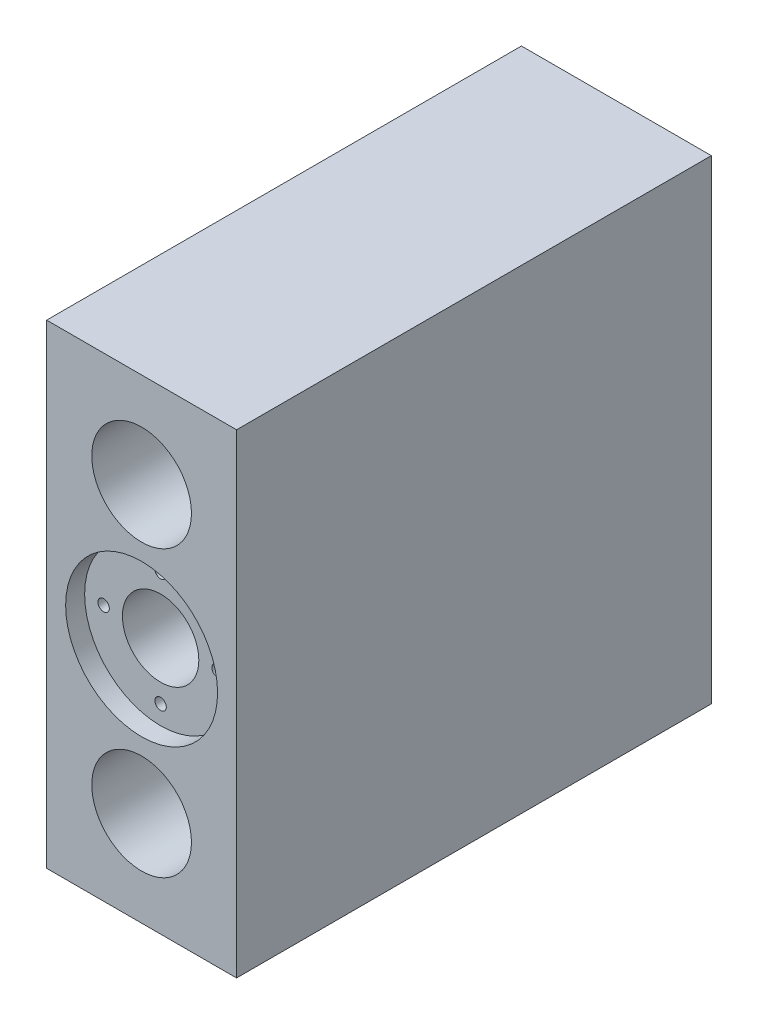
ISO-10303-21;
HEADER;
FILE_DESCRIPTION(('STEP AP214'),'2;1');
FILE_NAME('part.step','',(''),(''),'','','');
FILE_SCHEMA(('AUTOMOTIVE_DESIGN { 1 0 10303 214 1 1 1 1 }'));
ENDSEC;
DATA;
#1=APPLICATION_CONTEXT('core data for automotive mechanical design processes');
#2=APPLICATION_PROTOCOL_DEFINITION('international standard','automotive_design',2000,#1);
#3=PRODUCT_CONTEXT('',#1,'mechanical');
#4=PRODUCT('Part','Part','',(#3));
#5=PRODUCT_RELATED_PRODUCT_CATEGORY('part','',(#4));
#6=PRODUCT_DEFINITION_FORMATION('','',#4);
#7=PRODUCT_DEFINITION_CONTEXT('part definition',#1,'design');
#8=PRODUCT_DEFINITION('design','',#6,#7);
#9=PRODUCT_DEFINITION_SHAPE('','',#8);
#10=(LENGTH_UNIT() NAMED_UNIT(*) SI_UNIT(.MILLI.,.METRE.));
#11=(NAMED_UNIT(*) PLANE_ANGLE_UNIT() SI_UNIT($,.RADIAN.));
#12=(NAMED_UNIT(*) SI_UNIT($,.STERADIAN.) SOLID_ANGLE_UNIT());
#13=UNCERTAINTY_MEASURE_WITH_UNIT(LENGTH_MEASURE(1.E-05),#10,'distance_accuracy_value','');
#14=(GEOMETRIC_REPRESENTATION_CONTEXT(3) GLOBAL_UNCERTAINTY_ASSIGNED_CONTEXT((#13)) GLOBAL_UNIT_ASSIGNED_CONTEXT((#10,
#11,#12)) REPRESENTATION_CONTEXT('',''));
#15=CARTESIAN_POINT('',(0.,0.,0.));
#16=DIRECTION('',(0.,0.,1.));
#17=DIRECTION('',(1.,0.,0.));
#18=AXIS2_PLACEMENT_3D('',#15,#16,#17);
#19=CARTESIAN_POINT('',(20.,-50.,100.));
#20=DIRECTION('',(0.,0.,-1.));
#21=DIRECTION('',(-1.,0.,0.));
#22=AXIS2_PLACEMENT_3D('',#19,#20,#21);
#23=CYLINDRICAL_SURFACE('',#22,5.5);
#24=CARTESIAN_POINT('',(20.,-50.,80.));
#25=DIRECTION('',(0.,0.,1.));
#26=DIRECTION('',(1.,0.,0.));
#27=AXIS2_PLACEMENT_3D('',#24,#25,#26);
#28=CIRCLE('',#27,5.5);
#29=CARTESIAN_POINT('',(25.5,-50.,80.));
#30=VERTEX_POINT('',#29);
#31=EDGE_CURVE('E108',#30,#30,#28,.T.);
#32=ORIENTED_EDGE('',*,*,#31,.T.);
#33=EDGE_LOOP('',(#32));
#34=FACE_BOUND('',#33,.T.);
#35=CARTESIAN_POINT('',(20.,-50.,20.));
#36=DIRECTION('',(0.,0.,-1.));
#37=DIRECTION('',(-1.,0.,0.));
#38=AXIS2_PLACEMENT_3D('',#35,#36,#37);
#39=CIRCLE('',#38,5.5);
#40=CARTESIAN_POINT('',(14.5,-50.,20.));
#41=VERTEX_POINT('',#40);
#42=EDGE_CURVE('E36',#41,#41,#39,.T.);
#43=ORIENTED_EDGE('',*,*,#42,.T.);
#44=EDGE_LOOP('',(#43));
#45=FACE_BOUND('',#44,.T.);
#46=ADVANCED_FACE('F32',(#34,#45),#23,.F.);
#47=CARTESIAN_POINT('',(0.,0.,100.));
#48=DIRECTION('',(0.,0.,1.));
#49=DIRECTION('',(1.,0.,0.));
#50=AXIS2_PLACEMENT_3D('',#47,#48,#49);
#51=PLANE('',#50);
#52=CARTESIAN_POINT('',(20.,-50.,100.));
#53=DIRECTION('',(0.,0.,1.));
#54=DIRECTION('',(1.,0.,0.));
#55=AXIS2_PLACEMENT_3D('',#52,#53,#54);
#56=CIRCLE('',#55,16.);
#57=CARTESIAN_POINT('',(36.,-50.,100.));
#58=VERTEX_POINT('',#57);
#59=EDGE_CURVE('E110',#58,#58,#56,.T.);
#60=ORIENTED_EDGE('',*,*,#59,.F.);
#61=EDGE_LOOP('',(#60));
#62=FACE_BOUND('',#61,.T.);
#63=CARTESIAN_POINT('',(20.,-20.,100.));
#64=DIRECTION('',(0.,0.,1.));
#65=DIRECTION('',(1.,0.,0.));
#66=AXIS2_PLACEMENT_3D('',#63,#64,#65);
#67=CIRCLE('',#66,10.5);
#68=CARTESIAN_POINT('',(30.5,-20.,100.));
#69=VERTEX_POINT('',#68);
#70=EDGE_CURVE('E103',#69,#69,#67,.T.);
#71=ORIENTED_EDGE('',*,*,#70,.F.);
#72=EDGE_LOOP('',(#71));
#73=FACE_BOUND('',#72,.T.);
#74=DIRECTION('',(0.,-1.,0.));
#75=VECTOR('',#74,1.);
#76=CARTESIAN_POINT('',(0.,0.,100.));
#77=LINE('',#76,#75);
#78=CARTESIAN_POINT('',(0.,0.,100.));
#79=VERTEX_POINT('',#78);
#80=CARTESIAN_POINT('',(0.,-100.,100.));
#81=VERTEX_POINT('',#80);
#82=EDGE_CURVE('E87',#79,#81,#77,.T.);
#83=ORIENTED_EDGE('',*,*,#82,.T.);
#84=DIRECTION('',(1.,0.,0.));
#85=VECTOR('',#84,1.);
#86=CARTESIAN_POINT('',(0.,-100.,100.));
#87=LINE('',#86,#85);
#88=CARTESIAN_POINT('',(40.,-100.,100.));
#89=VERTEX_POINT('',#88);
#90=EDGE_CURVE('E81',#81,#89,#87,.T.);
#91=ORIENTED_EDGE('',*,*,#90,.T.);
#92=DIRECTION('',(0.,1.,0.));
#93=VECTOR('',#92,1.);
#94=CARTESIAN_POINT('',(40.,0.,100.));
#95=LINE('',#94,#93);
#96=CARTESIAN_POINT('',(40.,0.,100.));
#97=VERTEX_POINT('',#96);
#98=EDGE_CURVE('E85',#89,#97,#95,.T.);
#99=ORIENTED_EDGE('',*,*,#98,.T.);
#100=DIRECTION('',(-1.,0.,0.));
#101=VECTOR('',#100,1.);
#102=CARTESIAN_POINT('',(0.,0.,100.));
#103=LINE('',#102,#101);
#104=EDGE_CURVE('E51',#97,#79,#103,.T.);
#105=ORIENTED_EDGE('',*,*,#104,.T.);
#106=EDGE_LOOP('',(#83,#91,#99,#105));
#107=FACE_BOUND('',#106,.T.);
#108=CARTESIAN_POINT('',(20.,-80.,100.));
#109=DIRECTION('',(0.,0.,1.));
#110=DIRECTION('',(1.,0.,0.));
#111=AXIS2_PLACEMENT_3D('',#108,#109,#110);
#112=CIRCLE('',#111,10.5);
#113=CARTESIAN_POINT('',(30.5,-80.,100.));
#114=VERTEX_POINT('',#113);
#115=EDGE_CURVE('E132',#114,#114,#112,.T.);
#116=ORIENTED_EDGE('',*,*,#115,.F.);
#117=EDGE_LOOP('',(#116));
#118=FACE_BOUND('',#117,.T.);
#119=ADVANCED_FACE('F82',(#62,#73,#107,#118),#51,.T.);
#120=CARTESIAN_POINT('',(0.,0.,0.));
#121=DIRECTION('',(0.,0.,1.));
#122=DIRECTION('',(1.,0.,0.));
#123=AXIS2_PLACEMENT_3D('',#120,#121,#122);
#124=PLANE('',#123);
#125=CARTESIAN_POINT('',(20.,-50.,0.));
#126=DIRECTION('',(0.,0.,-1.));
#127=DIRECTION('',(-1.,0.,0.));
#128=AXIS2_PLACEMENT_3D('',#125,#126,#127);
#129=CIRCLE('',#128,16.);
#130=CARTESIAN_POINT('',(4.00000000000001,-50.,0.));
#131=VERTEX_POINT('',#130);
#132=EDGE_CURVE('E475',#131,#131,#129,.T.);
#133=ORIENTED_EDGE('',*,*,#132,.F.);
#134=EDGE_LOOP('',(#133));
#135=FACE_BOUND('',#134,.T.);
#136=DIRECTION('',(0.,-1.,0.));
#137=VECTOR('',#136,1.);
#138=CARTESIAN_POINT('',(0.,0.,0.));
#139=LINE('',#138,#137);
#140=CARTESIAN_POINT('',(0.,0.,0.));
#141=VERTEX_POINT('',#140);
#142=CARTESIAN_POINT('',(0.,-100.,0.));
#143=VERTEX_POINT('',#142);
#144=EDGE_CURVE('E100',#141,#143,#139,.T.);
#145=ORIENTED_EDGE('',*,*,#144,.F.);
#146=DIRECTION('',(-1.,0.,0.));
#147=VECTOR('',#146,1.);
#148=CARTESIAN_POINT('',(0.,0.,0.));
#149=LINE('',#148,#147);
#150=CARTESIAN_POINT('',(40.,0.,0.));
#151=VERTEX_POINT('',#150);
#152=EDGE_CURVE('E74',#151,#141,#149,.T.);
#153=ORIENTED_EDGE('',*,*,#152,.F.);
#154=DIRECTION('',(0.,1.,0.));
#155=VECTOR('',#154,1.);
#156=CARTESIAN_POINT('',(40.,0.,0.));
#157=LINE('',#156,#155);
#158=CARTESIAN_POINT('',(40.,-100.,0.));
#159=VERTEX_POINT('',#158);
#160=EDGE_CURVE('E68',#159,#151,#157,.T.);
#161=ORIENTED_EDGE('',*,*,#160,.F.);
#162=DIRECTION('',(1.,0.,0.));
#163=VECTOR('',#162,1.);
#164=CARTESIAN_POINT('',(0.,-100.,0.));
#165=LINE('',#164,#163);
#166=EDGE_CURVE('E91',#143,#159,#165,.T.);
#167=ORIENTED_EDGE('',*,*,#166,.F.);
#168=EDGE_LOOP('',(#145,#153,#161,#167));
#169=FACE_BOUND('',#168,.T.);
#170=CARTESIAN_POINT('',(20.,-20.,0.));
#171=DIRECTION('',(0.,0.,1.));
#172=DIRECTION('',(1.,0.,0.));
#173=AXIS2_PLACEMENT_3D('',#170,#171,#172);
#174=CIRCLE('',#173,10.5);
#175=CARTESIAN_POINT('',(30.5,-20.,0.));
#176=VERTEX_POINT('',#175);
#177=EDGE_CURVE('E135',#176,#176,#174,.T.);
#178=ORIENTED_EDGE('',*,*,#177,.T.);
#179=EDGE_LOOP('',(#178));
#180=FACE_BOUND('',#179,.T.);
#181=CARTESIAN_POINT('',(20.,-80.,0.));
#182=DIRECTION('',(0.,0.,1.));
#183=DIRECTION('',(1.,0.,0.));
#184=AXIS2_PLACEMENT_3D('',#181,#182,#183);
#185=CIRCLE('',#184,10.5);
#186=CARTESIAN_POINT('',(30.5,-80.,0.));
#187=VERTEX_POINT('',#186);
#188=EDGE_CURVE('E130',#187,#187,#185,.T.);
#189=ORIENTED_EDGE('',*,*,#188,.T.);
#190=EDGE_LOOP('',(#189));
#191=FACE_BOUND('',#190,.T.);
#192=ADVANCED_FACE('F143',(#135,#169,#180,#191),#124,.F.);
#193=CARTESIAN_POINT('',(0.,0.,100.));
#194=DIRECTION('',(1.,0.,0.));
#195=DIRECTION('',(0.,1.,0.));
#196=AXIS2_PLACEMENT_3D('',#193,#194,#195);
#197=PLANE('',#196);
#198=ORIENTED_EDGE('',*,*,#144,.T.);
#199=DIRECTION('',(0.,0.,-1.));
#200=VECTOR('',#199,1.);
#201=CARTESIAN_POINT('',(0.,-100.,100.));
#202=LINE('',#201,#200);
#203=EDGE_CURVE('E11',#81,#143,#202,.T.);
#204=ORIENTED_EDGE('',*,*,#203,.F.);
#205=ORIENTED_EDGE('',*,*,#82,.F.);
#206=DIRECTION('',(0.,0.,-1.));
#207=VECTOR('',#206,1.);
#208=CARTESIAN_POINT('',(0.,0.,100.));
#209=LINE('',#208,#207);
#210=EDGE_CURVE('E96',#79,#141,#209,.T.);
#211=ORIENTED_EDGE('',*,*,#210,.T.);
#212=EDGE_LOOP('',(#198,#204,#205,#211));
#213=FACE_BOUND('',#212,.T.);
#214=ADVANCED_FACE('F34',(#213),#197,.F.);
#215=CARTESIAN_POINT('',(0.,-100.,100.));
#216=DIRECTION('',(0.,1.,0.));
#217=DIRECTION('',(0.,0.,1.));
#218=AXIS2_PLACEMENT_3D('',#215,#216,#217);
#219=PLANE('',#218);
#220=ORIENTED_EDGE('',*,*,#166,.T.);
#221=DIRECTION('',(0.,0.,-1.));
#222=VECTOR('',#221,1.);
#223=CARTESIAN_POINT('',(40.,-100.,100.));
#224=LINE('',#223,#222);
#225=EDGE_CURVE('E42',#89,#159,#224,.T.);
#226=ORIENTED_EDGE('',*,*,#225,.F.);
#227=ORIENTED_EDGE('',*,*,#90,.F.);
#228=ORIENTED_EDGE('',*,*,#203,.T.);
#229=EDGE_LOOP('',(#220,#226,#227,#228));
#230=FACE_BOUND('',#229,.T.);
#231=ADVANCED_FACE('F90',(#230),#219,.F.);
#232=CARTESIAN_POINT('',(40.,0.,100.));
#233=DIRECTION('',(-1.,0.,0.));
#234=DIRECTION('',(0.,-1.,0.));
#235=AXIS2_PLACEMENT_3D('',#232,#233,#234);
#236=PLANE('',#235);
#237=ORIENTED_EDGE('',*,*,#160,.T.);
#238=DIRECTION('',(0.,0.,-1.));
#239=VECTOR('',#238,1.);
#240=CARTESIAN_POINT('',(40.,0.,100.));
#241=LINE('',#240,#239);
#242=EDGE_CURVE('E92',#97,#151,#241,.T.);
#243=ORIENTED_EDGE('',*,*,#242,.F.);
#244=ORIENTED_EDGE('',*,*,#98,.F.);
#245=ORIENTED_EDGE('',*,*,#225,.T.);
#246=EDGE_LOOP('',(#237,#243,#244,#245));
#247=FACE_BOUND('',#246,.T.);
#248=ADVANCED_FACE('F94',(#247),#236,.F.);
#249=CARTESIAN_POINT('',(0.,0.,100.));
#250=DIRECTION('',(0.,-1.,0.));
#251=DIRECTION('',(1.,0.,0.));
#252=AXIS2_PLACEMENT_3D('',#249,#250,#251);
#253=PLANE('',#252);
#254=ORIENTED_EDGE('',*,*,#152,.T.);
#255=ORIENTED_EDGE('',*,*,#210,.F.);
#256=ORIENTED_EDGE('',*,*,#104,.F.);
#257=ORIENTED_EDGE('',*,*,#242,.T.);
#258=EDGE_LOOP('',(#254,#255,#256,#257));
#259=FACE_BOUND('',#258,.T.);
#260=ADVANCED_FACE('F149',(#259),#253,.F.);
#261=CARTESIAN_POINT('',(20.,-20.,100.));
#262=DIRECTION('',(0.,0.,-1.));
#263=DIRECTION('',(-1.,0.,0.));
#264=AXIS2_PLACEMENT_3D('',#261,#262,#263);
#265=CYLINDRICAL_SURFACE('',#264,10.5);
#266=ORIENTED_EDGE('',*,*,#70,.T.);
#267=EDGE_LOOP('',(#266));
#268=FACE_BOUND('',#267,.T.);
#269=ORIENTED_EDGE('',*,*,#177,.F.);
#270=EDGE_LOOP('',(#269));
#271=FACE_BOUND('',#270,.T.);
#272=ADVANCED_FACE('F146',(#268,#271),#265,.F.);
#273=CARTESIAN_POINT('',(20.,-80.,100.));
#274=DIRECTION('',(0.,0.,-1.));
#275=DIRECTION('',(-1.,0.,0.));
#276=AXIS2_PLACEMENT_3D('',#273,#274,#275);
#277=CYLINDRICAL_SURFACE('',#276,10.5);
#278=ORIENTED_EDGE('',*,*,#115,.T.);
#279=EDGE_LOOP('',(#278));
#280=FACE_BOUND('',#279,.T.);
#281=ORIENTED_EDGE('',*,*,#188,.F.);
#282=EDGE_LOOP('',(#281));
#283=FACE_BOUND('',#282,.T.);
#284=ADVANCED_FACE('F148',(#280,#283),#277,.F.);
#285=CARTESIAN_POINT('',(20.,-50.,96.));
#286=DIRECTION('',(0.,0.,1.));
#287=DIRECTION('',(1.,0.,0.));
#288=AXIS2_PLACEMENT_3D('',#285,#286,#287);
#289=CYLINDRICAL_SURFACE('',#288,16.);
#290=CARTESIAN_POINT('',(20.,-50.,96.));
#291=DIRECTION('',(0.,0.,1.));
#292=DIRECTION('',(1.,0.,0.));
#293=AXIS2_PLACEMENT_3D('',#290,#291,#292);
#294=CIRCLE('',#293,16.);
#295=CARTESIAN_POINT('',(36.,-50.,96.));
#296=VERTEX_POINT('',#295);
#297=EDGE_CURVE('E115',#296,#296,#294,.T.);
#298=ORIENTED_EDGE('',*,*,#297,.F.);
#299=EDGE_LOOP('',(#298));
#300=FACE_BOUND('',#299,.T.);
#301=ORIENTED_EDGE('',*,*,#59,.T.);
#302=EDGE_LOOP('',(#301));
#303=FACE_BOUND('',#302,.T.);
#304=ADVANCED_FACE('F156',(#300,#303),#289,.F.);
#305=CARTESIAN_POINT('',(20.,-50.,96.));
#306=DIRECTION('',(0.,0.,1.));
#307=DIRECTION('',(1.,0.,0.));
#308=AXIS2_PLACEMENT_3D('',#305,#306,#307);
#309=PLANE('',#308);
#310=CARTESIAN_POINT('',(20.,-38.,96.));
#311=DIRECTION('',(0.,0.,1.));
#312=DIRECTION('',(1.,0.,0.));
#313=AXIS2_PLACEMENT_3D('',#310,#311,#312);
#314=CIRCLE('',#313,1.2);
#315=CARTESIAN_POINT('',(21.2,-38.,96.));
#316=VERTEX_POINT('',#315);
#317=EDGE_CURVE('E480',#316,#316,#314,.T.);
#318=ORIENTED_EDGE('',*,*,#317,.F.);
#319=EDGE_LOOP('',(#318));
#320=FACE_BOUND('',#319,.T.);
#321=CARTESIAN_POINT('',(8.00000000000001,-50.,96.));
#322=DIRECTION('',(0.,0.,1.));
#323=DIRECTION('',(1.,0.,0.));
#324=AXIS2_PLACEMENT_3D('',#321,#322,#323);
#325=CIRCLE('',#324,1.2);
#326=CARTESIAN_POINT('',(9.20000000000001,-50.,96.));
#327=VERTEX_POINT('',#326);
#328=EDGE_CURVE('E486',#327,#327,#325,.T.);
#329=ORIENTED_EDGE('',*,*,#328,.F.);
#330=EDGE_LOOP('',(#329));
#331=FACE_BOUND('',#330,.T.);
#332=CARTESIAN_POINT('',(32.,-50.,96.));
#333=DIRECTION('',(0.,0.,1.));
#334=DIRECTION('',(1.,0.,0.));
#335=AXIS2_PLACEMENT_3D('',#332,#333,#334);
#336=CIRCLE('',#335,1.2);
#337=CARTESIAN_POINT('',(33.2,-50.,96.));
#338=VERTEX_POINT('',#337);
#339=EDGE_CURVE('E492',#338,#338,#336,.T.);
#340=ORIENTED_EDGE('',*,*,#339,.F.);
#341=EDGE_LOOP('',(#340));
#342=FACE_BOUND('',#341,.T.);
#343=CARTESIAN_POINT('',(20.,-62.,96.));
#344=DIRECTION('',(0.,0.,1.));
#345=DIRECTION('',(1.,0.,0.));
#346=AXIS2_PLACEMENT_3D('',#343,#344,#345);
#347=CIRCLE('',#346,1.2);
#348=CARTESIAN_POINT('',(21.2,-62.,96.));
#349=VERTEX_POINT('',#348);
#350=EDGE_CURVE('E126',#349,#349,#347,.T.);
#351=ORIENTED_EDGE('',*,*,#350,.F.);
#352=EDGE_LOOP('',(#351));
#353=FACE_BOUND('',#352,.T.);
#354=CARTESIAN_POINT('',(20.,-50.,96.));
#355=DIRECTION('',(0.,0.,1.));
#356=DIRECTION('',(1.,0.,0.));
#357=AXIS2_PLACEMENT_3D('',#354,#355,#356);
#358=CIRCLE('',#357,8.05);
#359=CARTESIAN_POINT('',(28.05,-50.,96.));
#360=VERTEX_POINT('',#359);
#361=EDGE_CURVE('E118',#360,#360,#358,.T.);
#362=ORIENTED_EDGE('',*,*,#361,.F.);
#363=EDGE_LOOP('',(#362));
#364=FACE_BOUND('',#363,.T.);
#365=ORIENTED_EDGE('',*,*,#297,.T.);
#366=EDGE_LOOP('',(#365));
#367=FACE_BOUND('',#366,.T.);
#368=ADVANCED_FACE('F204',(#320,#331,#342,#353,#364,#367),#309,.T.);
#369=CARTESIAN_POINT('',(20.,-50.,80.));
#370=DIRECTION('',(0.,0.,1.));
#371=DIRECTION('',(1.,0.,0.));
#372=AXIS2_PLACEMENT_3D('',#369,#370,#371);
#373=CYLINDRICAL_SURFACE('',#372,8.05);
#374=CARTESIAN_POINT('',(20.,-50.,80.));
#375=DIRECTION('',(0.,0.,1.));
#376=DIRECTION('',(1.,0.,0.));
#377=AXIS2_PLACEMENT_3D('',#374,#375,#376);
#378=CIRCLE('',#377,8.05);
#379=CARTESIAN_POINT('',(28.05,-50.,80.));
#380=VERTEX_POINT('',#379);
#381=EDGE_CURVE('E111',#380,#380,#378,.T.);
#382=ORIENTED_EDGE('',*,*,#381,.F.);
#383=EDGE_LOOP('',(#382));
#384=FACE_BOUND('',#383,.T.);
#385=ORIENTED_EDGE('',*,*,#361,.T.);
#386=EDGE_LOOP('',(#385));
#387=FACE_BOUND('',#386,.T.);
#388=ADVANCED_FACE('F212',(#384,#387),#373,.F.);
#389=CARTESIAN_POINT('',(20.,-50.,80.));
#390=DIRECTION('',(0.,0.,1.));
#391=DIRECTION('',(1.,0.,0.));
#392=AXIS2_PLACEMENT_3D('',#389,#390,#391);
#393=PLANE('',#392);
#394=ORIENTED_EDGE('',*,*,#31,.F.);
#395=EDGE_LOOP('',(#394));
#396=FACE_BOUND('',#395,.T.);
#397=ORIENTED_EDGE('',*,*,#381,.T.);
#398=EDGE_LOOP('',(#397));
#399=FACE_BOUND('',#398,.T.);
#400=ADVANCED_FACE('F217',(#396,#399),#393,.T.);
#401=CARTESIAN_POINT('',(20.,-62.,81.));
#402=DIRECTION('',(0.,0.,1.));
#403=DIRECTION('',(1.,0.,0.));
#404=AXIS2_PLACEMENT_3D('',#401,#402,#403);
#405=CYLINDRICAL_SURFACE('',#404,1.2);
#406=CARTESIAN_POINT('',(20.,-62.,81.));
#407=DIRECTION('',(0.,0.,1.));
#408=DIRECTION('',(1.,0.,0.));
#409=AXIS2_PLACEMENT_3D('',#406,#407,#408);
#410=CIRCLE('',#409,1.2);
#411=CARTESIAN_POINT('',(21.2,-62.,81.));
#412=VERTEX_POINT('',#411);
#413=EDGE_CURVE('E494',#412,#412,#410,.T.);
#414=ORIENTED_EDGE('',*,*,#413,.F.);
#415=EDGE_LOOP('',(#414));
#416=FACE_BOUND('',#415,.T.);
#417=ORIENTED_EDGE('',*,*,#350,.T.);
#418=EDGE_LOOP('',(#417));
#419=FACE_BOUND('',#418,.T.);
#420=ADVANCED_FACE('F227',(#416,#419),#405,.F.);
#421=CARTESIAN_POINT('',(20.,-62.,81.));
#422=DIRECTION('',(0.,0.,1.));
#423=DIRECTION('',(1.,0.,0.));
#424=AXIS2_PLACEMENT_3D('',#421,#422,#423);
#425=PLANE('',#424);
#426=ORIENTED_EDGE('',*,*,#413,.T.);
#427=EDGE_LOOP('',(#426));
#428=FACE_BOUND('',#427,.T.);
#429=ADVANCED_FACE('F244',(#428),#425,.T.);
#430=CARTESIAN_POINT('',(32.,-50.,81.));
#431=DIRECTION('',(0.,0.,1.));
#432=DIRECTION('',(1.,0.,0.));
#433=AXIS2_PLACEMENT_3D('',#430,#431,#432);
#434=CYLINDRICAL_SURFACE('',#433,1.2);
#435=CARTESIAN_POINT('',(32.,-50.,81.));
#436=DIRECTION('',(0.,0.,1.));
#437=DIRECTION('',(1.,0.,0.));
#438=AXIS2_PLACEMENT_3D('',#435,#436,#437);
#439=CIRCLE('',#438,1.2);
#440=CARTESIAN_POINT('',(33.2,-50.,81.));
#441=VERTEX_POINT('',#440);
#442=EDGE_CURVE('E489',#441,#441,#439,.T.);
#443=ORIENTED_EDGE('',*,*,#442,.F.);
#444=EDGE_LOOP('',(#443));
#445=FACE_BOUND('',#444,.T.);
#446=ORIENTED_EDGE('',*,*,#339,.T.);
#447=EDGE_LOOP('',(#446));
#448=FACE_BOUND('',#447,.T.);
#449=ADVANCED_FACE('F254',(#445,#448),#434,.F.);
#450=CARTESIAN_POINT('',(32.,-50.,81.));
#451=DIRECTION('',(0.,0.,1.));
#452=DIRECTION('',(1.,0.,0.));
#453=AXIS2_PLACEMENT_3D('',#450,#451,#452);
#454=PLANE('',#453);
#455=ORIENTED_EDGE('',*,*,#442,.T.);
#456=EDGE_LOOP('',(#455));
#457=FACE_BOUND('',#456,.T.);
#458=ADVANCED_FACE('F264',(#457),#454,.T.);
#459=CARTESIAN_POINT('',(8.00000000000001,-50.,81.));
#460=DIRECTION('',(0.,0.,1.));
#461=DIRECTION('',(1.,0.,0.));
#462=AXIS2_PLACEMENT_3D('',#459,#460,#461);
#463=CYLINDRICAL_SURFACE('',#462,1.2);
#464=CARTESIAN_POINT('',(8.00000000000001,-50.,81.));
#465=DIRECTION('',(0.,0.,1.));
#466=DIRECTION('',(1.,0.,0.));
#467=AXIS2_PLACEMENT_3D('',#464,#465,#466);
#468=CIRCLE('',#467,1.2);
#469=CARTESIAN_POINT('',(9.20000000000001,-50.,81.));
#470=VERTEX_POINT('',#469);
#471=EDGE_CURVE('E483',#470,#470,#468,.T.);
#472=ORIENTED_EDGE('',*,*,#471,.F.);
#473=EDGE_LOOP('',(#472));
#474=FACE_BOUND('',#473,.T.);
#475=ORIENTED_EDGE('',*,*,#328,.T.);
#476=EDGE_LOOP('',(#475));
#477=FACE_BOUND('',#476,.T.);
#478=ADVANCED_FACE('F274',(#474,#477),#463,.F.);
#479=CARTESIAN_POINT('',(8.00000000000001,-50.,81.));
#480=DIRECTION('',(0.,0.,1.));
#481=DIRECTION('',(1.,0.,0.));
#482=AXIS2_PLACEMENT_3D('',#479,#480,#481);
#483=PLANE('',#482);
#484=ORIENTED_EDGE('',*,*,#471,.T.);
#485=EDGE_LOOP('',(#484));
#486=FACE_BOUND('',#485,.T.);
#487=ADVANCED_FACE('F284',(#486),#483,.T.);
#488=CARTESIAN_POINT('',(20.,-38.,81.));
#489=DIRECTION('',(0.,0.,1.));
#490=DIRECTION('',(1.,0.,0.));
#491=AXIS2_PLACEMENT_3D('',#488,#489,#490);
#492=CYLINDRICAL_SURFACE('',#491,1.2);
#493=CARTESIAN_POINT('',(20.,-38.,81.));
#494=DIRECTION('',(0.,0.,1.));
#495=DIRECTION('',(1.,0.,0.));
#496=AXIS2_PLACEMENT_3D('',#493,#494,#495);
#497=CIRCLE('',#496,1.2);
#498=CARTESIAN_POINT('',(21.2,-38.,81.));
#499=VERTEX_POINT('',#498);
#500=EDGE_CURVE('E123',#499,#499,#497,.T.);
#501=ORIENTED_EDGE('',*,*,#500,.F.);
#502=EDGE_LOOP('',(#501));
#503=FACE_BOUND('',#502,.T.);
#504=ORIENTED_EDGE('',*,*,#317,.T.);
#505=EDGE_LOOP('',(#504));
#506=FACE_BOUND('',#505,.T.);
#507=ADVANCED_FACE('F294',(#503,#506),#492,.F.);
#508=CARTESIAN_POINT('',(20.,-38.,81.));
#509=DIRECTION('',(0.,0.,1.));
#510=DIRECTION('',(1.,0.,0.));
#511=AXIS2_PLACEMENT_3D('',#508,#509,#510);
#512=PLANE('',#511);
#513=ORIENTED_EDGE('',*,*,#500,.T.);
#514=EDGE_LOOP('',(#513));
#515=FACE_BOUND('',#514,.T.);
#516=ADVANCED_FACE('F303',(#515),#512,.T.);
#517=CARTESIAN_POINT('',(20.,-50.,4.));
#518=DIRECTION('',(0.,0.,-1.));
#519=DIRECTION('',(-1.,0.,0.));
#520=AXIS2_PLACEMENT_3D('',#517,#518,#519);
#521=CYLINDRICAL_SURFACE('',#520,16.);
#522=CARTESIAN_POINT('',(20.,-50.,4.));
#523=DIRECTION('',(0.,0.,-1.));
#524=DIRECTION('',(-1.,0.,0.));
#525=AXIS2_PLACEMENT_3D('',#522,#523,#524);
#526=CIRCLE('',#525,16.);
#527=CARTESIAN_POINT('',(4.00000000000001,-50.,4.));
#528=VERTEX_POINT('',#527);
#529=EDGE_CURVE('E472',#528,#528,#526,.T.);
#530=ORIENTED_EDGE('',*,*,#529,.F.);
#531=EDGE_LOOP('',(#530));
#532=FACE_BOUND('',#531,.T.);
#533=ORIENTED_EDGE('',*,*,#132,.T.);
#534=EDGE_LOOP('',(#533));
#535=FACE_BOUND('',#534,.T.);
#536=ADVANCED_FACE('F312',(#532,#535),#521,.F.);
#537=CARTESIAN_POINT('',(20.,-50.,4.));
#538=DIRECTION('',(0.,0.,-1.));
#539=DIRECTION('',(-1.,0.,0.));
#540=AXIS2_PLACEMENT_3D('',#537,#538,#539);
#541=PLANE('',#540);
#542=CARTESIAN_POINT('',(20.,-62.,4.));
#543=DIRECTION('',(0.,0.,-1.));
#544=DIRECTION('',(-1.,0.,0.));
#545=AXIS2_PLACEMENT_3D('',#542,#543,#544);
#546=CIRCLE('',#545,1.2);
#547=CARTESIAN_POINT('',(18.8,-62.,4.));
#548=VERTEX_POINT('',#547);
#549=EDGE_CURVE('E444',#548,#548,#546,.T.);
#550=ORIENTED_EDGE('',*,*,#549,.F.);
#551=EDGE_LOOP('',(#550));
#552=FACE_BOUND('',#551,.T.);
#553=CARTESIAN_POINT('',(32.,-50.,4.));
#554=DIRECTION('',(0.,0.,-1.));
#555=DIRECTION('',(-1.,0.,0.));
#556=AXIS2_PLACEMENT_3D('',#553,#554,#555);
#557=CIRCLE('',#556,1.2);
#558=CARTESIAN_POINT('',(30.8,-50.,4.));
#559=VERTEX_POINT('',#558);
#560=EDGE_CURVE('E455',#559,#559,#557,.T.);
#561=ORIENTED_EDGE('',*,*,#560,.F.);
#562=EDGE_LOOP('',(#561));
#563=FACE_BOUND('',#562,.T.);
#564=CARTESIAN_POINT('',(8.00000000000001,-50.,4.));
#565=DIRECTION('',(0.,0.,-1.));
#566=DIRECTION('',(-1.,0.,0.));
#567=AXIS2_PLACEMENT_3D('',#564,#565,#566);
#568=CIRCLE('',#567,1.2);
#569=CARTESIAN_POINT('',(6.80000000000001,-50.,4.));
#570=VERTEX_POINT('',#569);
#571=EDGE_CURVE('E461',#570,#570,#568,.T.);
#572=ORIENTED_EDGE('',*,*,#571,.F.);
#573=EDGE_LOOP('',(#572));
#574=FACE_BOUND('',#573,.T.);
#575=CARTESIAN_POINT('',(20.,-38.,4.));
#576=DIRECTION('',(0.,0.,-1.));
#577=DIRECTION('',(-1.,0.,0.));
#578=AXIS2_PLACEMENT_3D('',#575,#576,#577);
#579=CIRCLE('',#578,1.2);
#580=CARTESIAN_POINT('',(18.8,-38.,4.));
#581=VERTEX_POINT('',#580);
#582=EDGE_CURVE('E467',#581,#581,#579,.T.);
#583=ORIENTED_EDGE('',*,*,#582,.F.);
#584=EDGE_LOOP('',(#583));
#585=FACE_BOUND('',#584,.T.);
#586=CARTESIAN_POINT('',(20.,-50.,4.));
#587=DIRECTION('',(0.,0.,-1.));
#588=DIRECTION('',(-1.,0.,0.));
#589=AXIS2_PLACEMENT_3D('',#586,#587,#588);
#590=CIRCLE('',#589,8.05);
#591=CARTESIAN_POINT('',(11.95,-50.,4.));
#592=VERTEX_POINT('',#591);
#593=EDGE_CURVE('E443',#592,#592,#590,.T.);
#594=ORIENTED_EDGE('',*,*,#593,.F.);
#595=EDGE_LOOP('',(#594));
#596=FACE_BOUND('',#595,.T.);
#597=ORIENTED_EDGE('',*,*,#529,.T.);
#598=EDGE_LOOP('',(#597));
#599=FACE_BOUND('',#598,.T.);
#600=ADVANCED_FACE('F322',(#552,#563,#574,#585,#596,#599),#541,.T.);
#601=CARTESIAN_POINT('',(20.,-50.,20.));
#602=DIRECTION('',(0.,0.,-1.));
#603=DIRECTION('',(-1.,0.,0.));
#604=AXIS2_PLACEMENT_3D('',#601,#602,#603);
#605=CYLINDRICAL_SURFACE('',#604,8.05);
#606=CARTESIAN_POINT('',(20.,-50.,20.));
#607=DIRECTION('',(0.,0.,-1.));
#608=DIRECTION('',(-1.,0.,0.));
#609=AXIS2_PLACEMENT_3D('',#606,#607,#608);
#610=CIRCLE('',#609,8.05);
#611=CARTESIAN_POINT('',(11.95,-50.,20.));
#612=VERTEX_POINT('',#611);
#613=EDGE_CURVE('E447',#612,#612,#610,.T.);
#614=ORIENTED_EDGE('',*,*,#613,.F.);
#615=EDGE_LOOP('',(#614));
#616=FACE_BOUND('',#615,.T.);
#617=ORIENTED_EDGE('',*,*,#593,.T.);
#618=EDGE_LOOP('',(#617));
#619=FACE_BOUND('',#618,.T.);
#620=ADVANCED_FACE('F329',(#616,#619),#605,.F.);
#621=CARTESIAN_POINT('',(20.,-50.,20.));
#622=DIRECTION('',(0.,0.,-1.));
#623=DIRECTION('',(-1.,0.,0.));
#624=AXIS2_PLACEMENT_3D('',#621,#622,#623);
#625=PLANE('',#624);
#626=ORIENTED_EDGE('',*,*,#42,.F.);
#627=EDGE_LOOP('',(#626));
#628=FACE_BOUND('',#627,.T.);
#629=ORIENTED_EDGE('',*,*,#613,.T.);
#630=EDGE_LOOP('',(#629));
#631=FACE_BOUND('',#630,.T.);
#632=ADVANCED_FACE('F339',(#628,#631),#625,.T.);
#633=CARTESIAN_POINT('',(20.,-38.,19.));
#634=DIRECTION('',(0.,0.,-1.));
#635=DIRECTION('',(-1.,0.,0.));
#636=AXIS2_PLACEMENT_3D('',#633,#634,#635);
#637=CYLINDRICAL_SURFACE('',#636,1.2);
#638=CARTESIAN_POINT('',(20.,-38.,19.));
#639=DIRECTION('',(0.,0.,-1.));
#640=DIRECTION('',(-1.,0.,0.));
#641=AXIS2_PLACEMENT_3D('',#638,#639,#640);
#642=CIRCLE('',#641,1.2);
#643=CARTESIAN_POINT('',(18.8,-38.,19.));
#644=VERTEX_POINT('',#643);
#645=EDGE_CURVE('E464',#644,#644,#642,.T.);
#646=ORIENTED_EDGE('',*,*,#645,.F.);
#647=EDGE_LOOP('',(#646));
#648=FACE_BOUND('',#647,.T.);
#649=ORIENTED_EDGE('',*,*,#582,.T.);
#650=EDGE_LOOP('',(#649));
#651=FACE_BOUND('',#650,.T.);
#652=ADVANCED_FACE('F346',(#648,#651),#637,.F.);
#653=CARTESIAN_POINT('',(20.,-38.,19.));
#654=DIRECTION('',(0.,0.,-1.));
#655=DIRECTION('',(-1.,0.,0.));
#656=AXIS2_PLACEMENT_3D('',#653,#654,#655);
#657=PLANE('',#656);
#658=ORIENTED_EDGE('',*,*,#645,.T.);
#659=EDGE_LOOP('',(#658));
#660=FACE_BOUND('',#659,.T.);
#661=ADVANCED_FACE('F353',(#660),#657,.T.);
#662=CARTESIAN_POINT('',(8.00000000000001,-50.,19.));
#663=DIRECTION('',(0.,0.,-1.));
#664=DIRECTION('',(-1.,0.,0.));
#665=AXIS2_PLACEMENT_3D('',#662,#663,#664);
#666=CYLINDRICAL_SURFACE('',#665,1.2);
#667=CARTESIAN_POINT('',(8.00000000000001,-50.,19.));
#668=DIRECTION('',(0.,0.,-1.));
#669=DIRECTION('',(-1.,0.,0.));
#670=AXIS2_PLACEMENT_3D('',#667,#668,#669);
#671=CIRCLE('',#670,1.2);
#672=CARTESIAN_POINT('',(6.80000000000001,-50.,19.));
#673=VERTEX_POINT('',#672);
#674=EDGE_CURVE('E458',#673,#673,#671,.T.);
#675=ORIENTED_EDGE('',*,*,#674,.F.);
#676=EDGE_LOOP('',(#675));
#677=FACE_BOUND('',#676,.T.);
#678=ORIENTED_EDGE('',*,*,#571,.T.);
#679=EDGE_LOOP('',(#678));
#680=FACE_BOUND('',#679,.T.);
#681=ADVANCED_FACE('F361',(#677,#680),#666,.F.);
#682=CARTESIAN_POINT('',(8.00000000000001,-50.,19.));
#683=DIRECTION('',(0.,0.,-1.));
#684=DIRECTION('',(-1.,0.,0.));
#685=AXIS2_PLACEMENT_3D('',#682,#683,#684);
#686=PLANE('',#685);
#687=ORIENTED_EDGE('',*,*,#674,.T.);
#688=EDGE_LOOP('',(#687));
#689=FACE_BOUND('',#688,.T.);
#690=ADVANCED_FACE('F369',(#689),#686,.T.);
#691=CARTESIAN_POINT('',(32.,-50.,19.));
#692=DIRECTION('',(0.,0.,-1.));
#693=DIRECTION('',(-1.,0.,0.));
#694=AXIS2_PLACEMENT_3D('',#691,#692,#693);
#695=CYLINDRICAL_SURFACE('',#694,1.2);
#696=CARTESIAN_POINT('',(32.,-50.,19.));
#697=DIRECTION('',(0.,0.,-1.));
#698=DIRECTION('',(-1.,0.,0.));
#699=AXIS2_PLACEMENT_3D('',#696,#697,#698);
#700=CIRCLE('',#699,1.2);
#701=CARTESIAN_POINT('',(30.8,-50.,19.));
#702=VERTEX_POINT('',#701);
#703=EDGE_CURVE('E450',#702,#702,#700,.T.);
#704=ORIENTED_EDGE('',*,*,#703,.F.);
#705=EDGE_LOOP('',(#704));
#706=FACE_BOUND('',#705,.T.);
#707=ORIENTED_EDGE('',*,*,#560,.T.);
#708=EDGE_LOOP('',(#707));
#709=FACE_BOUND('',#708,.T.);
#710=ADVANCED_FACE('F377',(#706,#709),#695,.F.);
#711=CARTESIAN_POINT('',(32.,-50.,19.));
#712=DIRECTION('',(0.,0.,-1.));
#713=DIRECTION('',(-1.,0.,0.));
#714=AXIS2_PLACEMENT_3D('',#711,#712,#713);
#715=PLANE('',#714);
#716=ORIENTED_EDGE('',*,*,#703,.T.);
#717=EDGE_LOOP('',(#716));
#718=FACE_BOUND('',#717,.T.);
#719=ADVANCED_FACE('F385',(#718),#715,.T.);
#720=CARTESIAN_POINT('',(20.,-62.,19.));
#721=DIRECTION('',(0.,0.,-1.));
#722=DIRECTION('',(-1.,0.,0.));
#723=AXIS2_PLACEMENT_3D('',#720,#721,#722);
#724=CYLINDRICAL_SURFACE('',#723,1.2);
#725=CARTESIAN_POINT('',(20.,-62.,19.));
#726=DIRECTION('',(0.,0.,-1.));
#727=DIRECTION('',(-1.,0.,0.));
#728=AXIS2_PLACEMENT_3D('',#725,#726,#727);
#729=CIRCLE('',#728,1.2);
#730=CARTESIAN_POINT('',(18.8,-62.,19.));
#731=VERTEX_POINT('',#730);
#732=EDGE_CURVE('E442',#731,#731,#729,.T.);
#733=ORIENTED_EDGE('',*,*,#732,.F.);
#734=EDGE_LOOP('',(#733));
#735=FACE_BOUND('',#734,.T.);
#736=ORIENTED_EDGE('',*,*,#549,.T.);
#737=EDGE_LOOP('',(#736));
#738=FACE_BOUND('',#737,.T.);
#739=ADVANCED_FACE('F393',(#735,#738),#724,.F.);
#740=CARTESIAN_POINT('',(20.,-62.,19.));
#741=DIRECTION('',(0.,0.,-1.));
#742=DIRECTION('',(-1.,0.,0.));
#743=AXIS2_PLACEMENT_3D('',#740,#741,#742);
#744=PLANE('',#743);
#745=ORIENTED_EDGE('',*,*,#732,.T.);
#746=EDGE_LOOP('',(#745));
#747=FACE_BOUND('',#746,.T.);
#748=ADVANCED_FACE('F401',(#747),#744,.T.);
#749=CLOSED_SHELL('',(#46,#119,#192,#214,#231,#248,#260,#272,#284,#304,#368,#388,#400,#420,#429,
#449,#458,#478,#487,#507,#516,#536,#600,#620,#632,#652,#661,#681,#690,#710,#719,#739,#748));
#750=MANIFOLD_SOLID_BREP('B2',#749);
#751=ADVANCED_BREP_SHAPE_REPRESENTATION('',(#18,#750),#14);
#752=SHAPE_DEFINITION_REPRESENTATION(#9,#751);
ENDSEC;
END-ISO-10303-21;
